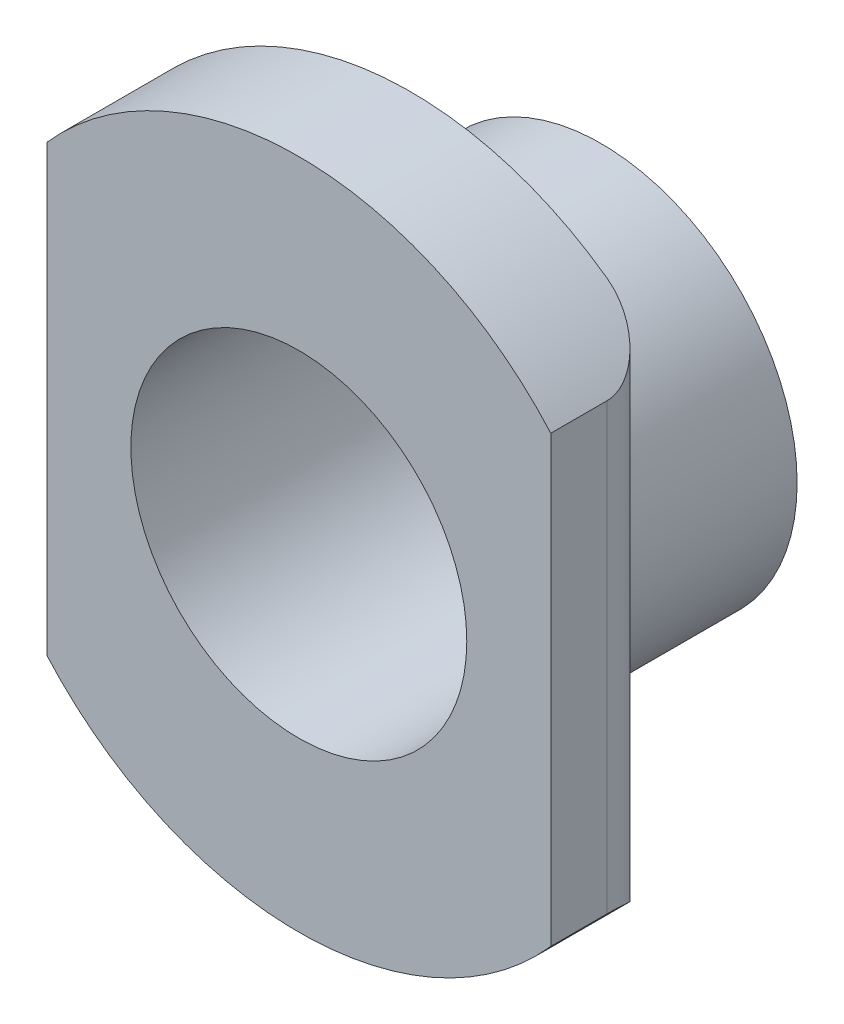
ISO-10303-21;
HEADER;
FILE_DESCRIPTION(('STEP AP214'),'2;1');
FILE_NAME('part.step','',(''),(''),'','','');
FILE_SCHEMA(('AUTOMOTIVE_DESIGN { 1 0 10303 214 1 1 1 1 }'));
ENDSEC;
DATA;
#1=APPLICATION_CONTEXT('core data for automotive mechanical design processes');
#2=APPLICATION_PROTOCOL_DEFINITION('international standard','automotive_design',2000,#1);
#3=PRODUCT_CONTEXT('',#1,'mechanical');
#4=PRODUCT('Part','Part','',(#3));
#5=PRODUCT_RELATED_PRODUCT_CATEGORY('part','',(#4));
#6=PRODUCT_DEFINITION_FORMATION('','',#4);
#7=PRODUCT_DEFINITION_CONTEXT('part definition',#1,'design');
#8=PRODUCT_DEFINITION('design','',#6,#7);
#9=PRODUCT_DEFINITION_SHAPE('','',#8);
#10=(LENGTH_UNIT() NAMED_UNIT(*) SI_UNIT(.MILLI.,.METRE.));
#11=(NAMED_UNIT(*) PLANE_ANGLE_UNIT() SI_UNIT($,.RADIAN.));
#12=(NAMED_UNIT(*) SI_UNIT($,.STERADIAN.) SOLID_ANGLE_UNIT());
#13=UNCERTAINTY_MEASURE_WITH_UNIT(LENGTH_MEASURE(1.E-05),#10,'distance_accuracy_value','');
#14=(GEOMETRIC_REPRESENTATION_CONTEXT(3) GLOBAL_UNCERTAINTY_ASSIGNED_CONTEXT((#13)) GLOBAL_UNIT_ASSIGNED_CONTEXT((#10,
#11,#12)) REPRESENTATION_CONTEXT('',''));
#15=CARTESIAN_POINT('',(0.,0.,0.));
#16=DIRECTION('',(0.,0.,1.));
#17=DIRECTION('',(1.,0.,0.));
#18=AXIS2_PLACEMENT_3D('',#15,#16,#17);
#19=CARTESIAN_POINT('',(0.,0.,0.));
#20=DIRECTION('',(0.,0.,1.));
#21=DIRECTION('',(1.,0.,0.));
#22=AXIS2_PLACEMENT_3D('',#19,#20,#21);
#23=PLANE('',#22);
#24=CARTESIAN_POINT('',(0.,0.,0.));
#25=DIRECTION('',(0.,0.,1.));
#26=DIRECTION('',(1.,0.,0.));
#27=AXIS2_PLACEMENT_3D('',#24,#25,#26);
#28=CIRCLE('',#27,1.75);
#29=CARTESIAN_POINT('',(1.75,0.,0.));
#30=VERTEX_POINT('',#29);
#31=EDGE_CURVE('E133',#30,#30,#28,.T.);
#32=ORIENTED_EDGE('',*,*,#31,.F.);
#33=EDGE_LOOP('',(#32));
#34=FACE_BOUND('',#33,.T.);
#35=CARTESIAN_POINT('',(0.,0.,0.));
#36=DIRECTION('',(0.,0.,1.));
#37=DIRECTION('',(1.,0.,0.));
#38=AXIS2_PLACEMENT_3D('',#35,#36,#37);
#39=CIRCLE('',#38,1.5);
#40=CARTESIAN_POINT('',(1.5,0.,0.));
#41=VERTEX_POINT('',#40);
#42=EDGE_CURVE('E130',#41,#41,#39,.T.);
#43=ORIENTED_EDGE('',*,*,#42,.T.);
#44=EDGE_LOOP('',(#43));
#45=FACE_BOUND('',#44,.T.);
#46=ADVANCED_FACE('F48',(#34,#45),#23,.F.);
#47=CARTESIAN_POINT('',(0.,0.,1.7));
#48=DIRECTION('',(0.,0.,-1.));
#49=DIRECTION('',(-1.,0.,0.));
#50=AXIS2_PLACEMENT_3D('',#47,#48,#49);
#51=CYLINDRICAL_SURFACE('',#50,1.75);
#52=CARTESIAN_POINT('',(0.,0.,1.7));
#53=DIRECTION('',(0.,0.,1.));
#54=DIRECTION('',(1.,0.,0.));
#55=AXIS2_PLACEMENT_3D('',#52,#53,#54);
#56=CIRCLE('',#55,1.75);
#57=CARTESIAN_POINT('',(1.75,0.,1.7));
#58=VERTEX_POINT('',#57);
#59=EDGE_CURVE('E139',#58,#58,#56,.T.);
#60=ORIENTED_EDGE('',*,*,#59,.F.);
#61=EDGE_LOOP('',(#60));
#62=FACE_BOUND('',#61,.T.);
#63=ORIENTED_EDGE('',*,*,#31,.T.);
#64=EDGE_LOOP('',(#63));
#65=FACE_BOUND('',#64,.T.);
#66=ADVANCED_FACE('F168',(#62,#65),#51,.T.);
#67=CARTESIAN_POINT('',(0.,0.,1.7));
#68=DIRECTION('',(0.,0.,-1.));
#69=DIRECTION('',(-1.,0.,0.));
#70=AXIS2_PLACEMENT_3D('',#67,#68,#69);
#71=CYLINDRICAL_SURFACE('',#70,1.5);
#72=ORIENTED_EDGE('',*,*,#42,.F.);
#73=EDGE_LOOP('',(#72));
#74=FACE_BOUND('',#73,.T.);
#75=CARTESIAN_POINT('',(0.,0.,2.7));
#76=DIRECTION('',(0.,0.,1.));
#77=DIRECTION('',(1.,0.,0.));
#78=AXIS2_PLACEMENT_3D('',#75,#76,#77);
#79=CIRCLE('',#78,1.5);
#80=CARTESIAN_POINT('',(1.5,0.,2.7));
#81=VERTEX_POINT('',#80);
#82=EDGE_CURVE('E185',#81,#81,#79,.F.);
#83=ORIENTED_EDGE('',*,*,#82,.F.);
#84=EDGE_LOOP('',(#83));
#85=FACE_BOUND('',#84,.T.);
#86=ADVANCED_FACE('F165',(#74,#85),#71,.F.);
#87=CARTESIAN_POINT('',(2.25,0.,2.7));
#88=DIRECTION('',(-1.,0.,0.));
#89=DIRECTION('',(0.,0.,1.));
#90=AXIS2_PLACEMENT_3D('',#87,#88,#89);
#91=PLANE('',#90);
#92=DIRECTION('',(0.,0.,-1.));
#93=VECTOR('',#92,1.);
#94=CARTESIAN_POINT('',(2.25,-1.98431348329844,2.7));
#95=LINE('',#94,#93);
#96=CARTESIAN_POINT('',(2.25,-1.98431348329844,2.7));
#97=VERTEX_POINT('',#96);
#98=CARTESIAN_POINT('',(2.25,-1.98431348329844,2.2));
#99=VERTEX_POINT('',#98);
#100=EDGE_CURVE('E186',#97,#99,#95,.T.);
#101=ORIENTED_EDGE('',*,*,#100,.T.);
#102=DIRECTION('',(0.,1.,0.));
#103=VECTOR('',#102,1.);
#104=CARTESIAN_POINT('',(2.25,0.,2.2));
#105=LINE('',#104,#103);
#106=CARTESIAN_POINT('',(2.25,1.98431348329844,2.2));
#107=VERTEX_POINT('',#106);
#108=EDGE_CURVE('E129',#99,#107,#105,.T.);
#109=ORIENTED_EDGE('',*,*,#108,.T.);
#110=DIRECTION('',(0.,0.,-1.));
#111=VECTOR('',#110,1.);
#112=CARTESIAN_POINT('',(2.25,1.98431348329844,2.7));
#113=LINE('',#112,#111);
#114=CARTESIAN_POINT('',(2.25,1.98431348329844,2.7));
#115=VERTEX_POINT('',#114);
#116=EDGE_CURVE('E107',#115,#107,#113,.T.);
#117=ORIENTED_EDGE('',*,*,#116,.F.);
#118=DIRECTION('',(0.,1.,0.));
#119=VECTOR('',#118,1.);
#120=CARTESIAN_POINT('',(2.25,0.,2.7));
#121=LINE('',#120,#119);
#122=EDGE_CURVE('E114',#97,#115,#121,.T.);
#123=ORIENTED_EDGE('',*,*,#122,.F.);
#124=EDGE_LOOP('',(#101,#109,#117,#123));
#125=FACE_BOUND('',#124,.T.);
#126=ADVANCED_FACE('F127',(#125),#91,.F.);
#127=CARTESIAN_POINT('',(0.,0.,2.7));
#128=DIRECTION('',(0.,0.,-1.));
#129=DIRECTION('',(-1.,0.,0.));
#130=AXIS2_PLACEMENT_3D('',#127,#128,#129);
#131=CYLINDRICAL_SURFACE('',#130,3.);
#132=ORIENTED_EDGE('',*,*,#116,.T.);
#133=CARTESIAN_POINT('',(2.25,1.98431348329844,2.2));
#134=CARTESIAN_POINT('',(2.2500386883185,1.98425804800435,2.17786634188954));
#135=CARTESIAN_POINT('',(2.24853325988189,1.98597727945672,2.15581833145935));
#136=CARTESIAN_POINT('',(2.24279690790911,1.99245872836587,2.11278605810749));
#137=CARTESIAN_POINT('',(2.23859710565462,1.99718619429664,2.09179256336454));
#138=CARTESIAN_POINT('',(2.22784423189818,2.00917148070625,2.05132008583723));
#139=CARTESIAN_POINT('',(2.22130164390252,2.01641802465258,2.03183481904333));
#140=CARTESIAN_POINT('',(2.20625124282134,2.03287518073448,1.99447326854173));
#141=CARTESIAN_POINT('',(2.19773729841129,2.04209191354853,1.97660225167985));
#142=CARTESIAN_POINT('',(2.17422629760202,2.06716372670753,1.93372160331983));
#143=CARTESIAN_POINT('',(2.15816483552275,2.08397277952368,1.90985453532337));
#144=CARTESIAN_POINT('',(2.12318038701982,2.11960701884388,1.8660463892042));
#145=CARTESIAN_POINT('',(2.10425089579165,2.13843675928288,1.84611447907901));
#146=CARTESIAN_POINT('',(2.05776556442807,2.1833329725922,1.80434796643402));
#147=CARTESIAN_POINT('',(2.02936994876956,2.20981169334496,1.78388932125176));
#148=CARTESIAN_POINT('',(1.96947061770203,2.26336101963829,1.74941690904066));
#149=CARTESIAN_POINT('',(1.93796832618626,2.29043134963683,1.73540020597576));
#150=CARTESIAN_POINT('',(1.88051775731749,2.33766462448557,1.71663493548904));
#151=CARTESIAN_POINT('',(1.85509000727167,2.35790119253312,1.71045939533643));
#152=CARTESIAN_POINT('',(1.80322653482951,2.39780275392767,1.70215218805142));
#153=CARTESIAN_POINT('',(1.77679268295119,2.41746869863239,1.70001335790976));
#154=CARTESIAN_POINT('',(1.75,2.43669858620224,1.7));
#155=B_SPLINE_CURVE_WITH_KNOTS('',3,(#133,#134,#135,#136,#137,#138,#139,#140,#141,#142,#143,
#144,#145,#146,#147,#148,#149,#150,#151,#152,#153,#154),.UNSPECIFIED.,.F.,.F.,(4,2,2,2,2,2,2,2,
2,2,4),(0.,0.0661477003676017,0.131544792619969,0.196652829527643,0.261966152494209,
0.361369367829521,0.461001505234833,0.591994954604773,0.722928641899985,0.821912024943615,
0.920719599483083),.UNSPECIFIED.);
#156=CARTESIAN_POINT('',(1.75,2.43669858620224,1.7));
#157=VERTEX_POINT('',#156);
#158=EDGE_CURVE('E144',#107,#157,#155,.T.);
#159=ORIENTED_EDGE('',*,*,#158,.T.);
#160=CARTESIAN_POINT('',(0.,0.,1.7));
#161=DIRECTION('',(0.,0.,1.));
#162=DIRECTION('',(1.,0.,0.));
#163=AXIS2_PLACEMENT_3D('',#160,#161,#162);
#164=CIRCLE('',#163,3.);
#165=CARTESIAN_POINT('',(-2.25,1.98431348329844,1.7));
#166=VERTEX_POINT('',#165);
#167=EDGE_CURVE('E191',#157,#166,#164,.T.);
#168=ORIENTED_EDGE('',*,*,#167,.T.);
#169=DIRECTION('',(0.,0.,-1.));
#170=VECTOR('',#169,1.);
#171=CARTESIAN_POINT('',(-2.25,1.98431348329844,2.7));
#172=LINE('',#171,#170);
#173=CARTESIAN_POINT('',(-2.25,1.98431348329844,2.7));
#174=VERTEX_POINT('',#173);
#175=EDGE_CURVE('E109',#174,#166,#172,.T.);
#176=ORIENTED_EDGE('',*,*,#175,.F.);
#177=CARTESIAN_POINT('',(0.,0.,2.7));
#178=DIRECTION('',(0.,0.,1.));
#179=DIRECTION('',(1.,0.,0.));
#180=AXIS2_PLACEMENT_3D('',#177,#178,#179);
#181=CIRCLE('',#180,3.);
#182=EDGE_CURVE('E103',#115,#174,#181,.T.);
#183=ORIENTED_EDGE('',*,*,#182,.F.);
#184=EDGE_LOOP('',(#132,#159,#168,#176,#183));
#185=FACE_BOUND('',#184,.T.);
#186=ADVANCED_FACE('F105',(#185),#131,.T.);
#187=CARTESIAN_POINT('',(-2.25,0.,2.7));
#188=DIRECTION('',(-1.,0.,0.));
#189=DIRECTION('',(0.,0.,1.));
#190=AXIS2_PLACEMENT_3D('',#187,#188,#189);
#191=PLANE('',#190);
#192=DIRECTION('',(0.,1.,0.));
#193=VECTOR('',#192,1.);
#194=CARTESIAN_POINT('',(-2.25,0.,1.7));
#195=LINE('',#194,#193);
#196=CARTESIAN_POINT('',(-2.25,-1.98431348329844,1.7));
#197=VERTEX_POINT('',#196);
#198=EDGE_CURVE('E193',#197,#166,#195,.T.);
#199=ORIENTED_EDGE('',*,*,#198,.F.);
#200=DIRECTION('',(0.,0.,-1.));
#201=VECTOR('',#200,1.);
#202=CARTESIAN_POINT('',(-2.25,-1.98431348329844,2.7));
#203=LINE('',#202,#201);
#204=CARTESIAN_POINT('',(-2.25,-1.98431348329844,2.7));
#205=VERTEX_POINT('',#204);
#206=EDGE_CURVE('E135',#205,#197,#203,.T.);
#207=ORIENTED_EDGE('',*,*,#206,.F.);
#208=DIRECTION('',(0.,1.,0.));
#209=VECTOR('',#208,1.);
#210=CARTESIAN_POINT('',(-2.25,0.,2.7));
#211=LINE('',#210,#209);
#212=EDGE_CURVE('E113',#205,#174,#211,.T.);
#213=ORIENTED_EDGE('',*,*,#212,.T.);
#214=ORIENTED_EDGE('',*,*,#175,.T.);
#215=EDGE_LOOP('',(#199,#207,#213,#214));
#216=FACE_BOUND('',#215,.T.);
#217=ADVANCED_FACE('F155',(#216),#191,.T.);
#218=CARTESIAN_POINT('',(1.75,-2.43669858620224,1.7));
#219=VERTEX_POINT('',#218);
#220=EDGE_CURVE('E124',#197,#219,#164,.T.);
#221=ORIENTED_EDGE('',*,*,#220,.T.);
#222=CARTESIAN_POINT('',(1.75,-2.43669858620224,1.7));
#223=CARTESIAN_POINT('',(1.78443779226494,-2.41200083651949,1.70003767952257));
#224=CARTESIAN_POINT('',(1.81826960218974,-2.38656407627208,1.70355478929522));
#225=CARTESIAN_POINT('',(1.88416414147105,-2.33487469189378,1.71714920588488));
#226=CARTESIAN_POINT('',(1.91621941883698,-2.30861926125957,1.72725216602794));
#227=CARTESIAN_POINT('',(1.97877620729076,-2.25526197525248,1.75406411954395));
#228=CARTESIAN_POINT('',(2.00918691182625,-2.22816192584692,1.77098749798315));
#229=CARTESIAN_POINT('',(2.06649313729122,-2.17511323883511,1.81133745480331));
#230=CARTESIAN_POINT('',(2.09339432593557,-2.14916279059103,1.83475335197825));
#231=CARTESIAN_POINT('',(2.13423433296784,-2.10845287721029,1.87916222307003));
#232=CARTESIAN_POINT('',(2.14946155548755,-2.09289925971423,1.89824938409941));
#233=CARTESIAN_POINT('',(2.17748208642513,-2.06372902964715,1.93946579559765));
#234=CARTESIAN_POINT('',(2.19027918746647,-2.05010940726441,1.96159021135178));
#235=CARTESIAN_POINT('',(2.21012987350541,-2.02866663729942,2.00332229964489));
#236=CARTESIAN_POINT('',(2.21782670777106,-2.02023290686577,2.02230695482911));
#237=CARTESIAN_POINT('',(2.23098412358496,-2.00569334519134,2.06184811928855));
#238=CARTESIAN_POINT('',(2.23645122436692,-1.99958073120018,2.08239983462674));
#239=CARTESIAN_POINT('',(2.24367132302906,-1.99147222177999,2.11912585798658));
#240=CARTESIAN_POINT('',(2.24602191898521,-1.98881756975381,2.13503789546762));
#241=CARTESIAN_POINT('',(2.24919677235978,-1.98522431132898,2.16729020176009));
#242=CARTESIAN_POINT('',(2.25001260472395,-1.98429517748277,2.18363233781949));
#243=CARTESIAN_POINT('',(2.25,-1.98431348329844,2.2));
#244=B_SPLINE_CURVE_WITH_KNOTS('',3,(#222,#223,#224,#225,#226,#227,#228,#229,#230,#231,#232,
#233,#234,#235,#236,#237,#238,#239,#240,#241,#242,#243),.UNSPECIFIED.,.F.,.F.,(4,2,2,2,2,2,2,2,
2,2,4),(0.,0.126901014095083,0.254299313083733,0.386060569354497,0.517606330997982,
0.604205699723296,0.690668783989632,0.756894093453222,0.822924362601208,0.871671250724103,
0.920684961795275),.UNSPECIFIED.);
#245=EDGE_CURVE('E13',#219,#99,#244,.T.);
#246=ORIENTED_EDGE('',*,*,#245,.T.);
#247=ORIENTED_EDGE('',*,*,#100,.F.);
#248=EDGE_CURVE('E116',#205,#97,#181,.T.);
#249=ORIENTED_EDGE('',*,*,#248,.F.);
#250=ORIENTED_EDGE('',*,*,#206,.T.);
#251=EDGE_LOOP('',(#221,#246,#247,#249,#250));
#252=FACE_BOUND('',#251,.T.);
#253=ADVANCED_FACE('F150',(#252),#131,.T.);
#254=CARTESIAN_POINT('',(0.,0.,2.7));
#255=DIRECTION('',(0.,0.,1.));
#256=DIRECTION('',(1.,0.,0.));
#257=AXIS2_PLACEMENT_3D('',#254,#255,#256);
#258=PLANE('',#257);
#259=ORIENTED_EDGE('',*,*,#122,.T.);
#260=ORIENTED_EDGE('',*,*,#182,.T.);
#261=ORIENTED_EDGE('',*,*,#212,.F.);
#262=ORIENTED_EDGE('',*,*,#248,.T.);
#263=EDGE_LOOP('',(#259,#260,#261,#262));
#264=FACE_BOUND('',#263,.T.);
#265=ORIENTED_EDGE('',*,*,#82,.T.);
#266=EDGE_LOOP('',(#265));
#267=FACE_BOUND('',#266,.T.);
#268=ADVANCED_FACE('F118',(#264,#267),#258,.T.);
#269=CARTESIAN_POINT('',(0.,0.,1.7));
#270=DIRECTION('',(0.,0.,1.));
#271=DIRECTION('',(1.,0.,0.));
#272=AXIS2_PLACEMENT_3D('',#269,#270,#271);
#273=PLANE('',#272);
#274=ORIENTED_EDGE('',*,*,#167,.F.);
#275=DIRECTION('',(0.,1.,0.));
#276=VECTOR('',#275,1.);
#277=CARTESIAN_POINT('',(1.75,0.,1.7));
#278=LINE('',#277,#276);
#279=EDGE_CURVE('E62',#157,#58,#278,.F.);
#280=ORIENTED_EDGE('',*,*,#279,.T.);
#281=ORIENTED_EDGE('',*,*,#59,.T.);
#282=DIRECTION('',(0.,1.,0.));
#283=VECTOR('',#282,1.);
#284=CARTESIAN_POINT('',(1.75,0.,1.7));
#285=LINE('',#284,#283);
#286=EDGE_CURVE('E69',#58,#219,#285,.F.);
#287=ORIENTED_EDGE('',*,*,#286,.T.);
#288=ORIENTED_EDGE('',*,*,#220,.F.);
#289=ORIENTED_EDGE('',*,*,#198,.T.);
#290=EDGE_LOOP('',(#274,#280,#281,#287,#288,#289));
#291=FACE_BOUND('',#290,.T.);
#292=ADVANCED_FACE('F157',(#291),#273,.F.);
#293=CARTESIAN_POINT('',(1.75,0.,2.2));
#294=DIRECTION('',(0.,1.,0.));
#295=DIRECTION('',(0.,0.,1.));
#296=AXIS2_PLACEMENT_3D('',#293,#294,#295);
#297=CYLINDRICAL_SURFACE('',#296,0.5);
#298=ORIENTED_EDGE('',*,*,#286,.F.);
#299=ORIENTED_EDGE('',*,*,#279,.F.);
#300=ORIENTED_EDGE('',*,*,#158,.F.);
#301=ORIENTED_EDGE('',*,*,#108,.F.);
#302=ORIENTED_EDGE('',*,*,#245,.F.);
#303=EDGE_LOOP('',(#298,#299,#300,#301,#302));
#304=FACE_BOUND('',#303,.T.);
#305=ADVANCED_FACE('F50',(#304),#297,.T.);
#306=CLOSED_SHELL('',(#46,#66,#86,#126,#186,#217,#253,#268,#292,#305));
#307=MANIFOLD_SOLID_BREP('B2',#306);
#308=ADVANCED_BREP_SHAPE_REPRESENTATION('',(#18,#307),#14);
#309=SHAPE_DEFINITION_REPRESENTATION(#9,#308);
ENDSEC;
END-ISO-10303-21;
